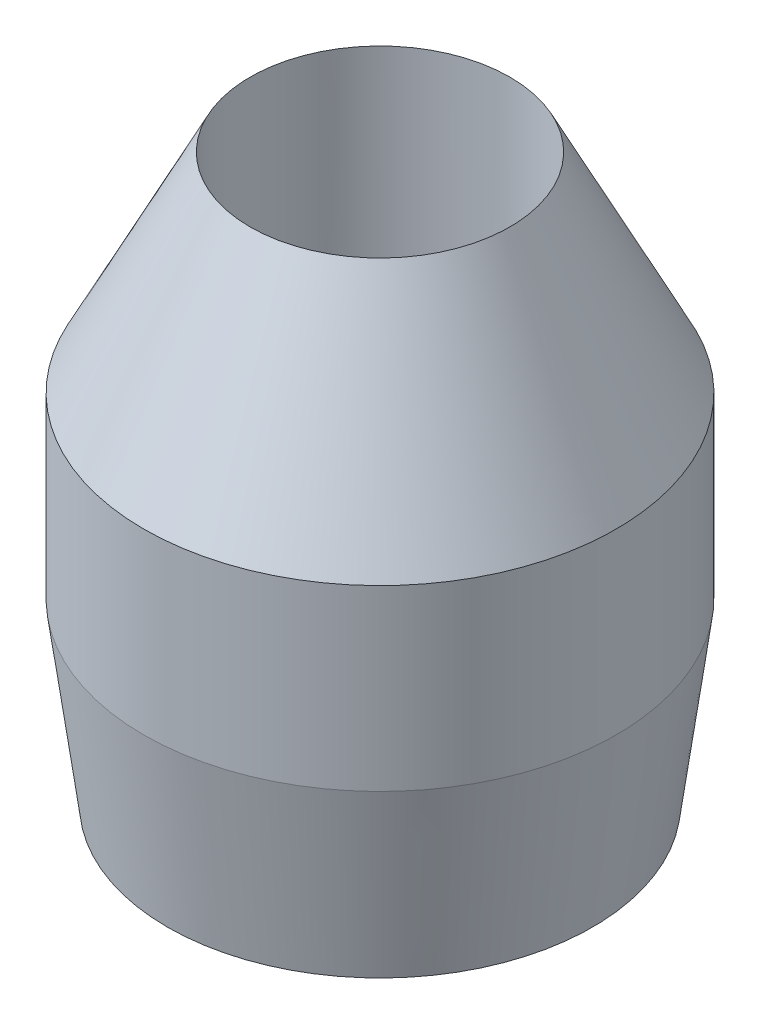
ISO-10303-21;
HEADER;
FILE_DESCRIPTION(('STEP AP214'),'2;1');
FILE_NAME('part.step','',(''),(''),'','','');
FILE_SCHEMA(('AUTOMOTIVE_DESIGN { 1 0 10303 214 1 1 1 1 }'));
ENDSEC;
DATA;
#1=APPLICATION_CONTEXT('core data for automotive mechanical design processes');
#2=APPLICATION_PROTOCOL_DEFINITION('international standard','automotive_design',2000,#1);
#3=PRODUCT_CONTEXT('',#1,'mechanical');
#4=PRODUCT('Part','Part','',(#3));
#5=PRODUCT_RELATED_PRODUCT_CATEGORY('part','',(#4));
#6=PRODUCT_DEFINITION_FORMATION('','',#4);
#7=PRODUCT_DEFINITION_CONTEXT('part definition',#1,'design');
#8=PRODUCT_DEFINITION('design','',#6,#7);
#9=PRODUCT_DEFINITION_SHAPE('','',#8);
#10=(LENGTH_UNIT() NAMED_UNIT(*) SI_UNIT(.MILLI.,.METRE.));
#11=(NAMED_UNIT(*) PLANE_ANGLE_UNIT() SI_UNIT($,.RADIAN.));
#12=(NAMED_UNIT(*) SI_UNIT($,.STERADIAN.) SOLID_ANGLE_UNIT());
#13=UNCERTAINTY_MEASURE_WITH_UNIT(LENGTH_MEASURE(1.E-05),#10,'distance_accuracy_value','');
#14=(GEOMETRIC_REPRESENTATION_CONTEXT(3) GLOBAL_UNCERTAINTY_ASSIGNED_CONTEXT((#13)) GLOBAL_UNIT_ASSIGNED_CONTEXT((#10,
#11,#12)) REPRESENTATION_CONTEXT('',''));
#15=CARTESIAN_POINT('',(0.,0.,0.));
#16=DIRECTION('',(0.,0.,1.));
#17=DIRECTION('',(1.,0.,0.));
#18=AXIS2_PLACEMENT_3D('',#15,#16,#17);
#19=CARTESIAN_POINT('',(0.,0.,0.));
#20=DIRECTION('',(0.,1.,0.));
#21=DIRECTION('',(0.,0.,1.));
#22=AXIS2_PLACEMENT_3D('',#19,#20,#21);
#23=PLANE('',#22);
#24=CARTESIAN_POINT('',(0.,0.,0.));
#25=DIRECTION('',(0.,-1.,0.));
#26=DIRECTION('',(0.,0.,-1.));
#27=AXIS2_PLACEMENT_3D('',#24,#25,#26);
#28=CIRCLE('',#27,8.25);
#29=CARTESIAN_POINT('',(0.,0.,-8.25));
#30=VERTEX_POINT('',#29);
#31=EDGE_CURVE('E45',#30,#30,#28,.T.);
#32=ORIENTED_EDGE('',*,*,#31,.F.);
#33=EDGE_LOOP('',(#32));
#34=FACE_BOUND('',#33,.T.);
#35=CARTESIAN_POINT('',(0.,0.,0.));
#36=DIRECTION('',(0.,-1.,0.));
#37=DIRECTION('',(0.,0.,-1.));
#38=AXIS2_PLACEMENT_3D('',#35,#36,#37);
#39=CIRCLE('',#38,9.);
#40=CARTESIAN_POINT('',(0.,0.,-9.));
#41=VERTEX_POINT('',#40);
#42=EDGE_CURVE('E62',#41,#41,#39,.T.);
#43=ORIENTED_EDGE('',*,*,#42,.T.);
#44=EDGE_LOOP('',(#43));
#45=FACE_BOUND('',#44,.T.);
#46=ADVANCED_FACE('F33',(#34,#45),#23,.F.);
#47=CARTESIAN_POINT('',(0.,15.1,0.));
#48=DIRECTION('',(0.,-1.,0.));
#49=DIRECTION('',(0.,0.,-1.));
#50=AXIS2_PLACEMENT_3D('',#47,#48,#49);
#51=CYLINDRICAL_SURFACE('',#50,10.);
#52=CARTESIAN_POINT('',(0.,7.55,0.));
#53=DIRECTION('',(0.,-1.,0.));
#54=DIRECTION('',(0.,0.,-1.));
#55=AXIS2_PLACEMENT_3D('',#52,#53,#54);
#56=CIRCLE('',#55,10.);
#57=CARTESIAN_POINT('',(0.,7.55,-10.));
#58=VERTEX_POINT('',#57);
#59=EDGE_CURVE('E59',#58,#58,#56,.T.);
#60=ORIENTED_EDGE('',*,*,#59,.F.);
#61=EDGE_LOOP('',(#60));
#62=FACE_BOUND('',#61,.T.);
#63=CARTESIAN_POINT('',(0.,15.1,0.));
#64=DIRECTION('',(0.,1.,0.));
#65=DIRECTION('',(0.,0.,1.));
#66=AXIS2_PLACEMENT_3D('',#63,#64,#65);
#67=CIRCLE('',#66,10.);
#68=CARTESIAN_POINT('',(0.,15.1,10.));
#69=VERTEX_POINT('',#68);
#70=EDGE_CURVE('E10',#69,#69,#67,.T.);
#71=ORIENTED_EDGE('',*,*,#70,.F.);
#72=EDGE_LOOP('',(#71));
#73=FACE_BOUND('',#72,.T.);
#74=ADVANCED_FACE('F35',(#62,#73),#51,.T.);
#75=CARTESIAN_POINT('',(0.,7.,0.));
#76=DIRECTION('',(0.,-1.,0.));
#77=DIRECTION('',(0.,0.,-1.));
#78=AXIS2_PLACEMENT_3D('',#75,#76,#77);
#79=CYLINDRICAL_SURFACE('',#78,8.25);
#80=CARTESIAN_POINT('',(0.,7.,0.));
#81=DIRECTION('',(0.,-1.,0.));
#82=DIRECTION('',(0.,0.,-1.));
#83=AXIS2_PLACEMENT_3D('',#80,#81,#82);
#84=CIRCLE('',#83,8.25);
#85=CARTESIAN_POINT('',(0.,7.,-8.25));
#86=VERTEX_POINT('',#85);
#87=EDGE_CURVE('E41',#86,#86,#84,.T.);
#88=ORIENTED_EDGE('',*,*,#87,.F.);
#89=EDGE_LOOP('',(#88));
#90=FACE_BOUND('',#89,.T.);
#91=ORIENTED_EDGE('',*,*,#31,.T.);
#92=EDGE_LOOP('',(#91));
#93=FACE_BOUND('',#92,.T.);
#94=ADVANCED_FACE('F76',(#90,#93),#79,.F.);
#95=CARTESIAN_POINT('',(0.,7.,0.));
#96=DIRECTION('',(0.,-1.,0.));
#97=DIRECTION('',(0.,0.,-1.));
#98=AXIS2_PLACEMENT_3D('',#95,#96,#97);
#99=PLANE('',#98);
#100=CARTESIAN_POINT('',(0.,7.,0.));
#101=DIRECTION('',(0.,-1.,0.));
#102=DIRECTION('',(0.,0.,-1.));
#103=AXIS2_PLACEMENT_3D('',#100,#101,#102);
#104=CIRCLE('',#103,6.35);
#105=CARTESIAN_POINT('',(0.,7.,-6.35));
#106=VERTEX_POINT('',#105);
#107=EDGE_CURVE('E51',#106,#106,#104,.T.);
#108=ORIENTED_EDGE('',*,*,#107,.F.);
#109=EDGE_LOOP('',(#108));
#110=FACE_BOUND('',#109,.T.);
#111=ORIENTED_EDGE('',*,*,#87,.T.);
#112=EDGE_LOOP('',(#111));
#113=FACE_BOUND('',#112,.T.);
#114=ADVANCED_FACE('F81',(#110,#113),#99,.T.);
#115=CARTESIAN_POINT('',(0.,15.1,0.));
#116=DIRECTION('',(0.,-1.,0.));
#117=DIRECTION('',(0.,0.,-1.));
#118=AXIS2_PLACEMENT_3D('',#115,#116,#117);
#119=CYLINDRICAL_SURFACE('',#118,6.35);
#120=CARTESIAN_POINT('',(0.,15.1,0.));
#121=DIRECTION('',(0.,-1.,0.));
#122=DIRECTION('',(0.,0.,-1.));
#123=AXIS2_PLACEMENT_3D('',#120,#121,#122);
#124=CIRCLE('',#123,6.35);
#125=CARTESIAN_POINT('',(0.,15.1,-6.35));
#126=VERTEX_POINT('',#125);
#127=EDGE_CURVE('E49',#126,#126,#124,.T.);
#128=ORIENTED_EDGE('',*,*,#127,.F.);
#129=EDGE_LOOP('',(#128));
#130=FACE_BOUND('',#129,.T.);
#131=ORIENTED_EDGE('',*,*,#107,.T.);
#132=EDGE_LOOP('',(#131));
#133=FACE_BOUND('',#132,.T.);
#134=ADVANCED_FACE('F91',(#130,#133),#119,.F.);
#135=CARTESIAN_POINT('',(0.,15.1,0.));
#136=DIRECTION('',(0.,1.,0.));
#137=DIRECTION('',(0.,0.,1.));
#138=AXIS2_PLACEMENT_3D('',#135,#136,#137);
#139=PLANE('',#138);
#140=CARTESIAN_POINT('',(0.,15.1,0.));
#141=DIRECTION('',(0.,1.,0.));
#142=DIRECTION('',(0.,0.,1.));
#143=AXIS2_PLACEMENT_3D('',#140,#141,#142);
#144=CIRCLE('',#143,5.5);
#145=CARTESIAN_POINT('',(0.,15.1,5.5));
#146=VERTEX_POINT('',#145);
#147=EDGE_CURVE('E56',#146,#146,#144,.T.);
#148=ORIENTED_EDGE('',*,*,#147,.T.);
#149=EDGE_LOOP('',(#148));
#150=FACE_BOUND('',#149,.T.);
#151=ORIENTED_EDGE('',*,*,#127,.T.);
#152=EDGE_LOOP('',(#151));
#153=FACE_BOUND('',#152,.T.);
#154=ADVANCED_FACE('F95',(#150,#153),#139,.F.);
#155=CARTESIAN_POINT('',(0.,15.1,0.));
#156=DIRECTION('',(0.,-1.,0.));
#157=DIRECTION('',(0.,0.,1.));
#158=AXIS2_PLACEMENT_3D('',#155,#156,#157);
#159=CONICAL_SURFACE('',#158,10.,0.471238898038469);
#160=CARTESIAN_POINT('',(0.,23.9317472747732,0.));
#161=DIRECTION('',(0.,-1.,0.));
#162=DIRECTION('',(0.,0.,-1.));
#163=AXIS2_PLACEMENT_3D('',#160,#161,#162);
#164=CIRCLE('',#163,5.5);
#165=CARTESIAN_POINT('',(0.,23.9317472747732,-5.5));
#166=VERTEX_POINT('',#165);
#167=EDGE_CURVE('E37',#166,#166,#164,.T.);
#168=ORIENTED_EDGE('',*,*,#167,.T.);
#169=EDGE_LOOP('',(#168));
#170=FACE_BOUND('',#169,.T.);
#171=ORIENTED_EDGE('',*,*,#70,.T.);
#172=EDGE_LOOP('',(#171));
#173=FACE_BOUND('',#172,.T.);
#174=ADVANCED_FACE('F97',(#170,#173),#159,.T.);
#175=CARTESIAN_POINT('',(0.,15.1,0.));
#176=DIRECTION('',(0.,1.,0.));
#177=DIRECTION('',(0.,0.,1.));
#178=AXIS2_PLACEMENT_3D('',#175,#176,#177);
#179=CYLINDRICAL_SURFACE('',#178,5.5);
#180=ORIENTED_EDGE('',*,*,#147,.F.);
#181=EDGE_LOOP('',(#180));
#182=FACE_BOUND('',#181,.T.);
#183=ORIENTED_EDGE('',*,*,#167,.F.);
#184=EDGE_LOOP('',(#183));
#185=FACE_BOUND('',#184,.T.);
#186=ADVANCED_FACE('F70',(#182,#185),#179,.F.);
#187=CARTESIAN_POINT('',(0.,7.55,0.));
#188=DIRECTION('',(0.,1.,0.));
#189=DIRECTION('',(0.,0.,1.));
#190=AXIS2_PLACEMENT_3D('',#187,#188,#189);
#191=CONICAL_SURFACE('',#190,10.,0.131683853555637);
#192=ORIENTED_EDGE('',*,*,#42,.F.);
#193=EDGE_LOOP('',(#192));
#194=FACE_BOUND('',#193,.T.);
#195=ORIENTED_EDGE('',*,*,#59,.T.);
#196=EDGE_LOOP('',(#195));
#197=FACE_BOUND('',#196,.T.);
#198=ADVANCED_FACE('F67',(#194,#197),#191,.T.);
#199=CLOSED_SHELL('',(#46,#74,#94,#114,#134,#154,#174,#186,#198));
#200=MANIFOLD_SOLID_BREP('B2',#199);
#201=ADVANCED_BREP_SHAPE_REPRESENTATION('',(#18,#200),#14);
#202=SHAPE_DEFINITION_REPRESENTATION(#9,#201);
ENDSEC;
END-ISO-10303-21;
